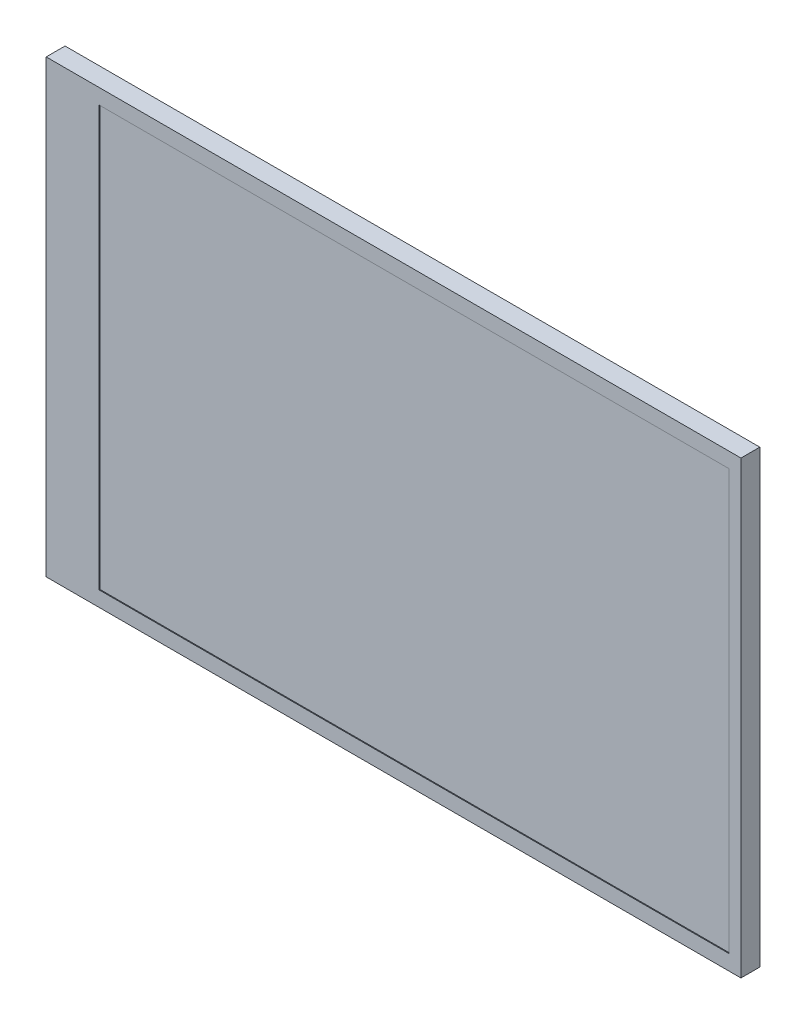
ISO-10303-21;
HEADER;
FILE_DESCRIPTION(('STEP AP214'),'2;1');
FILE_NAME('part.step','',(''),(''),'','','');
FILE_SCHEMA(('AUTOMOTIVE_DESIGN { 1 0 10303 214 1 1 1 1 }'));
ENDSEC;
DATA;
#1=APPLICATION_CONTEXT('core data for automotive mechanical design processes');
#2=APPLICATION_PROTOCOL_DEFINITION('international standard','automotive_design',2000,#1);
#3=PRODUCT_CONTEXT('',#1,'mechanical');
#4=PRODUCT('Part','Part','',(#3));
#5=PRODUCT_RELATED_PRODUCT_CATEGORY('part','',(#4));
#6=PRODUCT_DEFINITION_FORMATION('','',#4);
#7=PRODUCT_DEFINITION_CONTEXT('part definition',#1,'design');
#8=PRODUCT_DEFINITION('design','',#6,#7);
#9=PRODUCT_DEFINITION_SHAPE('','',#8);
#10=(LENGTH_UNIT() NAMED_UNIT(*) SI_UNIT(.MILLI.,.METRE.));
#11=(NAMED_UNIT(*) PLANE_ANGLE_UNIT() SI_UNIT($,.RADIAN.));
#12=(NAMED_UNIT(*) SI_UNIT($,.STERADIAN.) SOLID_ANGLE_UNIT());
#13=UNCERTAINTY_MEASURE_WITH_UNIT(LENGTH_MEASURE(1.E-05),#10,'distance_accuracy_value','');
#14=(GEOMETRIC_REPRESENTATION_CONTEXT(3) GLOBAL_UNCERTAINTY_ASSIGNED_CONTEXT((#13)) GLOBAL_UNIT_ASSIGNED_CONTEXT((#10,
#11,#12)) REPRESENTATION_CONTEXT('',''));
#15=CARTESIAN_POINT('',(0.,0.,0.));
#16=DIRECTION('',(0.,0.,1.));
#17=DIRECTION('',(1.,0.,0.));
#18=AXIS2_PLACEMENT_3D('',#15,#16,#17);
#19=CARTESIAN_POINT('',(44.1,-24.03,2.1));
#20=DIRECTION('',(0.,0.,-1.));
#21=DIRECTION('',(-1.,0.,0.));
#22=AXIS2_PLACEMENT_3D('',#19,#20,#21);
#23=PLANE('',#22);
#24=DIRECTION('',(-1.,0.,0.));
#25=VECTOR('',#24,1.);
#26=CARTESIAN_POINT('',(44.1,24.93,2.1));
#27=LINE('',#26,#25);
#28=CARTESIAN_POINT('',(44.1,24.93,2.1));
#29=VERTEX_POINT('',#28);
#30=CARTESIAN_POINT('',(-29.34,24.93,2.1));
#31=VERTEX_POINT('',#30);
#32=EDGE_CURVE('E104',#29,#31,#27,.T.);
#33=ORIENTED_EDGE('',*,*,#32,.T.);
#34=DIRECTION('',(0.,1.,0.));
#35=VECTOR('',#34,1.);
#36=CARTESIAN_POINT('',(-29.34,24.93,2.1));
#37=LINE('',#36,#35);
#38=CARTESIAN_POINT('',(-29.34,-24.03,2.1));
#39=VERTEX_POINT('',#38);
#40=EDGE_CURVE('E96',#31,#39,#37,.F.);
#41=ORIENTED_EDGE('',*,*,#40,.T.);
#42=DIRECTION('',(1.,0.,0.));
#43=VECTOR('',#42,1.);
#44=CARTESIAN_POINT('',(44.1,-24.03,2.1));
#45=LINE('',#44,#43);
#46=CARTESIAN_POINT('',(44.1,-24.03,2.1));
#47=VERTEX_POINT('',#46);
#48=EDGE_CURVE('E80',#39,#47,#45,.T.);
#49=ORIENTED_EDGE('',*,*,#48,.T.);
#50=DIRECTION('',(0.,1.,0.));
#51=VECTOR('',#50,1.);
#52=CARTESIAN_POINT('',(44.1,24.93,2.1));
#53=LINE('',#52,#51);
#54=EDGE_CURVE('E20',#47,#29,#53,.T.);
#55=ORIENTED_EDGE('',*,*,#54,.T.);
#56=EDGE_LOOP('',(#33,#41,#49,#55));
#57=FACE_BOUND('',#56,.T.);
#58=ADVANCED_FACE('F17',(#57),#23,.F.);
#59=CARTESIAN_POINT('',(44.1,24.93,2.1));
#60=DIRECTION('',(1.,0.,0.));
#61=DIRECTION('',(0.,0.,-1.));
#62=AXIS2_PLACEMENT_3D('',#59,#60,#61);
#63=PLANE('',#62);
#64=DIRECTION('',(0.,0.,1.));
#65=VECTOR('',#64,1.);
#66=CARTESIAN_POINT('',(44.1,24.93,2.1));
#67=LINE('',#66,#65);
#68=CARTESIAN_POINT('',(44.1,24.93,2.2));
#69=VERTEX_POINT('',#68);
#70=EDGE_CURVE('E90',#69,#29,#67,.F.);
#71=ORIENTED_EDGE('',*,*,#70,.T.);
#72=ORIENTED_EDGE('',*,*,#54,.F.);
#73=DIRECTION('',(0.,0.,1.));
#74=VECTOR('',#73,1.);
#75=CARTESIAN_POINT('',(44.1,-24.03,2.1));
#76=LINE('',#75,#74);
#77=CARTESIAN_POINT('',(44.1,-24.03,2.2));
#78=VERTEX_POINT('',#77);
#79=EDGE_CURVE('E88',#47,#78,#76,.T.);
#80=ORIENTED_EDGE('',*,*,#79,.T.);
#81=DIRECTION('',(0.,1.,0.));
#82=VECTOR('',#81,1.);
#83=CARTESIAN_POINT('',(44.1,-25.8,2.2));
#84=LINE('',#83,#82);
#85=EDGE_CURVE('E109',#69,#78,#84,.F.);
#86=ORIENTED_EDGE('',*,*,#85,.F.);
#87=EDGE_LOOP('',(#71,#72,#80,#86));
#88=FACE_BOUND('',#87,.T.);
#89=ADVANCED_FACE('F86',(#88),#63,.F.);
#90=CARTESIAN_POINT('',(44.1,-24.03,2.1));
#91=DIRECTION('',(0.,-1.,0.));
#92=DIRECTION('',(1.,0.,0.));
#93=AXIS2_PLACEMENT_3D('',#90,#91,#92);
#94=PLANE('',#93);
#95=ORIENTED_EDGE('',*,*,#79,.F.);
#96=ORIENTED_EDGE('',*,*,#48,.F.);
#97=DIRECTION('',(0.,0.,1.));
#98=VECTOR('',#97,1.);
#99=CARTESIAN_POINT('',(-29.34,-24.03,2.1));
#100=LINE('',#99,#98);
#101=CARTESIAN_POINT('',(-29.34,-24.03,2.2));
#102=VERTEX_POINT('',#101);
#103=EDGE_CURVE('E101',#39,#102,#100,.T.);
#104=ORIENTED_EDGE('',*,*,#103,.T.);
#105=DIRECTION('',(1.,0.,0.));
#106=VECTOR('',#105,1.);
#107=CARTESIAN_POINT('',(-35.5,-24.03,2.2));
#108=LINE('',#107,#106);
#109=EDGE_CURVE('E95',#78,#102,#108,.F.);
#110=ORIENTED_EDGE('',*,*,#109,.F.);
#111=EDGE_LOOP('',(#95,#96,#104,#110));
#112=FACE_BOUND('',#111,.T.);
#113=ADVANCED_FACE('F94',(#112),#94,.F.);
#114=CARTESIAN_POINT('',(-29.34,24.93,2.1));
#115=DIRECTION('',(-1.,0.,0.));
#116=DIRECTION('',(0.,0.,1.));
#117=AXIS2_PLACEMENT_3D('',#114,#115,#116);
#118=PLANE('',#117);
#119=ORIENTED_EDGE('',*,*,#103,.F.);
#120=ORIENTED_EDGE('',*,*,#40,.F.);
#121=DIRECTION('',(0.,0.,1.));
#122=VECTOR('',#121,1.);
#123=CARTESIAN_POINT('',(-29.34,24.93,2.1));
#124=LINE('',#123,#122);
#125=CARTESIAN_POINT('',(-29.34,24.93,2.2));
#126=VERTEX_POINT('',#125);
#127=EDGE_CURVE('E106',#31,#126,#124,.T.);
#128=ORIENTED_EDGE('',*,*,#127,.T.);
#129=DIRECTION('',(0.,1.,0.));
#130=VECTOR('',#129,1.);
#131=CARTESIAN_POINT('',(-29.34,-25.8,2.2));
#132=LINE('',#131,#130);
#133=EDGE_CURVE('E112',#102,#126,#132,.T.);
#134=ORIENTED_EDGE('',*,*,#133,.F.);
#135=EDGE_LOOP('',(#119,#120,#128,#134));
#136=FACE_BOUND('',#135,.T.);
#137=ADVANCED_FACE('F178',(#136),#118,.F.);
#138=CARTESIAN_POINT('',(44.1,24.93,2.1));
#139=DIRECTION('',(0.,1.,0.));
#140=DIRECTION('',(-1.,0.,0.));
#141=AXIS2_PLACEMENT_3D('',#138,#139,#140);
#142=PLANE('',#141);
#143=ORIENTED_EDGE('',*,*,#127,.F.);
#144=ORIENTED_EDGE('',*,*,#32,.F.);
#145=ORIENTED_EDGE('',*,*,#70,.F.);
#146=DIRECTION('',(1.,0.,0.));
#147=VECTOR('',#146,1.);
#148=CARTESIAN_POINT('',(-35.5,24.93,2.2));
#149=LINE('',#148,#147);
#150=EDGE_CURVE('E114',#126,#69,#149,.T.);
#151=ORIENTED_EDGE('',*,*,#150,.F.);
#152=EDGE_LOOP('',(#143,#144,#145,#151));
#153=FACE_BOUND('',#152,.T.);
#154=ADVANCED_FACE('F174',(#153),#142,.F.);
#155=CARTESIAN_POINT('',(-35.5,-25.8,2.2));
#156=DIRECTION('',(0.,0.,1.));
#157=DIRECTION('',(1.,0.,0.));
#158=AXIS2_PLACEMENT_3D('',#155,#156,#157);
#159=PLANE('',#158);
#160=DIRECTION('',(0.,-1.,0.));
#161=VECTOR('',#160,1.);
#162=CARTESIAN_POINT('',(45.5,26.7,2.2));
#163=LINE('',#162,#161);
#164=CARTESIAN_POINT('',(45.5,-25.8,2.2));
#165=VERTEX_POINT('',#164);
#166=CARTESIAN_POINT('',(45.5,26.7,2.2));
#167=VERTEX_POINT('',#166);
#168=EDGE_CURVE('E122',#165,#167,#163,.F.);
#169=ORIENTED_EDGE('',*,*,#168,.T.);
#170=DIRECTION('',(1.,0.,0.));
#171=VECTOR('',#170,1.);
#172=CARTESIAN_POINT('',(-35.5,26.7,2.2));
#173=LINE('',#172,#171);
#174=CARTESIAN_POINT('',(-35.5,26.7,2.2));
#175=VERTEX_POINT('',#174);
#176=EDGE_CURVE('E127',#167,#175,#173,.F.);
#177=ORIENTED_EDGE('',*,*,#176,.T.);
#178=DIRECTION('',(0.,1.,0.));
#179=VECTOR('',#178,1.);
#180=CARTESIAN_POINT('',(-35.5,26.7,2.2));
#181=LINE('',#180,#179);
#182=CARTESIAN_POINT('',(-35.5,-25.8,2.2));
#183=VERTEX_POINT('',#182);
#184=EDGE_CURVE('E130',#175,#183,#181,.F.);
#185=ORIENTED_EDGE('',*,*,#184,.T.);
#186=DIRECTION('',(1.,0.,0.));
#187=VECTOR('',#186,1.);
#188=CARTESIAN_POINT('',(-35.5,-25.8,2.2));
#189=LINE('',#188,#187);
#190=EDGE_CURVE('E117',#183,#165,#189,.T.);
#191=ORIENTED_EDGE('',*,*,#190,.T.);
#192=EDGE_LOOP('',(#169,#177,#185,#191));
#193=FACE_BOUND('',#192,.T.);
#194=ORIENTED_EDGE('',*,*,#133,.T.);
#195=ORIENTED_EDGE('',*,*,#150,.T.);
#196=ORIENTED_EDGE('',*,*,#85,.T.);
#197=ORIENTED_EDGE('',*,*,#109,.T.);
#198=EDGE_LOOP('',(#194,#195,#196,#197));
#199=FACE_BOUND('',#198,.T.);
#200=ADVANCED_FACE('F171',(#193,#199),#159,.T.);
#201=CARTESIAN_POINT('',(-35.5,-25.8,2.2));
#202=DIRECTION('',(0.,1.,0.));
#203=DIRECTION('',(0.,0.,1.));
#204=AXIS2_PLACEMENT_3D('',#201,#202,#203);
#205=PLANE('',#204);
#206=DIRECTION('',(0.,0.,1.));
#207=VECTOR('',#206,1.);
#208=CARTESIAN_POINT('',(45.5,-25.8,2.2));
#209=LINE('',#208,#207);
#210=CARTESIAN_POINT('',(45.5,-25.8,0.));
#211=VERTEX_POINT('',#210);
#212=EDGE_CURVE('E119',#211,#165,#209,.T.);
#213=ORIENTED_EDGE('',*,*,#212,.T.);
#214=ORIENTED_EDGE('',*,*,#190,.F.);
#215=DIRECTION('',(0.,0.,1.));
#216=VECTOR('',#215,1.);
#217=CARTESIAN_POINT('',(-35.5,-25.8,2.2));
#218=LINE('',#217,#216);
#219=CARTESIAN_POINT('',(-35.5,-25.8,0.));
#220=VERTEX_POINT('',#219);
#221=EDGE_CURVE('E133',#183,#220,#218,.F.);
#222=ORIENTED_EDGE('',*,*,#221,.T.);
#223=DIRECTION('',(1.,0.,0.));
#224=VECTOR('',#223,1.);
#225=CARTESIAN_POINT('',(-35.5,-25.8,0.));
#226=LINE('',#225,#224);
#227=EDGE_CURVE('E136',#220,#211,#226,.T.);
#228=ORIENTED_EDGE('',*,*,#227,.T.);
#229=EDGE_LOOP('',(#213,#214,#222,#228));
#230=FACE_BOUND('',#229,.T.);
#231=ADVANCED_FACE('F154',(#230),#205,.F.);
#232=CARTESIAN_POINT('',(45.5,26.7,2.2));
#233=DIRECTION('',(-1.,0.,0.));
#234=DIRECTION('',(0.,-1.,0.));
#235=AXIS2_PLACEMENT_3D('',#232,#233,#234);
#236=PLANE('',#235);
#237=DIRECTION('',(0.,0.,-1.));
#238=VECTOR('',#237,1.);
#239=CARTESIAN_POINT('',(45.5,26.7,2.2));
#240=LINE('',#239,#238);
#241=CARTESIAN_POINT('',(45.5,26.7,0.));
#242=VERTEX_POINT('',#241);
#243=EDGE_CURVE('E124',#242,#167,#240,.F.);
#244=ORIENTED_EDGE('',*,*,#243,.T.);
#245=ORIENTED_EDGE('',*,*,#168,.F.);
#246=ORIENTED_EDGE('',*,*,#212,.F.);
#247=DIRECTION('',(0.,1.,0.));
#248=VECTOR('',#247,1.);
#249=CARTESIAN_POINT('',(45.5,-25.8,0.));
#250=LINE('',#249,#248);
#251=EDGE_CURVE('E139',#211,#242,#250,.T.);
#252=ORIENTED_EDGE('',*,*,#251,.T.);
#253=EDGE_LOOP('',(#244,#245,#246,#252));
#254=FACE_BOUND('',#253,.T.);
#255=ADVANCED_FACE('F151',(#254),#236,.F.);
#256=CARTESIAN_POINT('',(-35.5,26.7,2.2));
#257=DIRECTION('',(0.,-1.,0.));
#258=DIRECTION('',(0.,0.,-1.));
#259=AXIS2_PLACEMENT_3D('',#256,#257,#258);
#260=PLANE('',#259);
#261=DIRECTION('',(0.,0.,1.));
#262=VECTOR('',#261,1.);
#263=CARTESIAN_POINT('',(-35.5,26.7,2.2));
#264=LINE('',#263,#262);
#265=CARTESIAN_POINT('',(-35.5,26.7,0.));
#266=VERTEX_POINT('',#265);
#267=EDGE_CURVE('E34',#266,#175,#264,.T.);
#268=ORIENTED_EDGE('',*,*,#267,.T.);
#269=ORIENTED_EDGE('',*,*,#176,.F.);
#270=ORIENTED_EDGE('',*,*,#243,.F.);
#271=DIRECTION('',(1.,0.,0.));
#272=VECTOR('',#271,1.);
#273=CARTESIAN_POINT('',(-35.5,26.7,0.));
#274=LINE('',#273,#272);
#275=EDGE_CURVE('E26',#242,#266,#274,.F.);
#276=ORIENTED_EDGE('',*,*,#275,.T.);
#277=EDGE_LOOP('',(#268,#269,#270,#276));
#278=FACE_BOUND('',#277,.T.);
#279=ADVANCED_FACE('F145',(#278),#260,.F.);
#280=CARTESIAN_POINT('',(-35.5,26.7,2.2));
#281=DIRECTION('',(1.,0.,0.));
#282=DIRECTION('',(0.,1.,0.));
#283=AXIS2_PLACEMENT_3D('',#280,#281,#282);
#284=PLANE('',#283);
#285=ORIENTED_EDGE('',*,*,#221,.F.);
#286=ORIENTED_EDGE('',*,*,#184,.F.);
#287=ORIENTED_EDGE('',*,*,#267,.F.);
#288=DIRECTION('',(0.,1.,0.));
#289=VECTOR('',#288,1.);
#290=CARTESIAN_POINT('',(-35.5,-25.8,0.));
#291=LINE('',#290,#289);
#292=EDGE_CURVE('E11',#266,#220,#291,.F.);
#293=ORIENTED_EDGE('',*,*,#292,.T.);
#294=EDGE_LOOP('',(#285,#286,#287,#293));
#295=FACE_BOUND('',#294,.T.);
#296=ADVANCED_FACE('F156',(#295),#284,.F.);
#297=CARTESIAN_POINT('',(-35.5,-25.8,0.));
#298=DIRECTION('',(0.,0.,1.));
#299=DIRECTION('',(1.,0.,0.));
#300=AXIS2_PLACEMENT_3D('',#297,#298,#299);
#301=PLANE('',#300);
#302=ORIENTED_EDGE('',*,*,#275,.F.);
#303=ORIENTED_EDGE('',*,*,#251,.F.);
#304=ORIENTED_EDGE('',*,*,#227,.F.);
#305=ORIENTED_EDGE('',*,*,#292,.F.);
#306=EDGE_LOOP('',(#302,#303,#304,#305));
#307=FACE_BOUND('',#306,.T.);
#308=ADVANCED_FACE('F149',(#307),#301,.F.);
#309=CLOSED_SHELL('',(#58,#89,#113,#137,#154,#200,#231,#255,#279,#296,#308));
#310=MANIFOLD_SOLID_BREP('B1',#309);
#311=ADVANCED_BREP_SHAPE_REPRESENTATION('',(#18,#310),#14);
#312=SHAPE_DEFINITION_REPRESENTATION(#9,#311);
ENDSEC;
END-ISO-10303-21;
